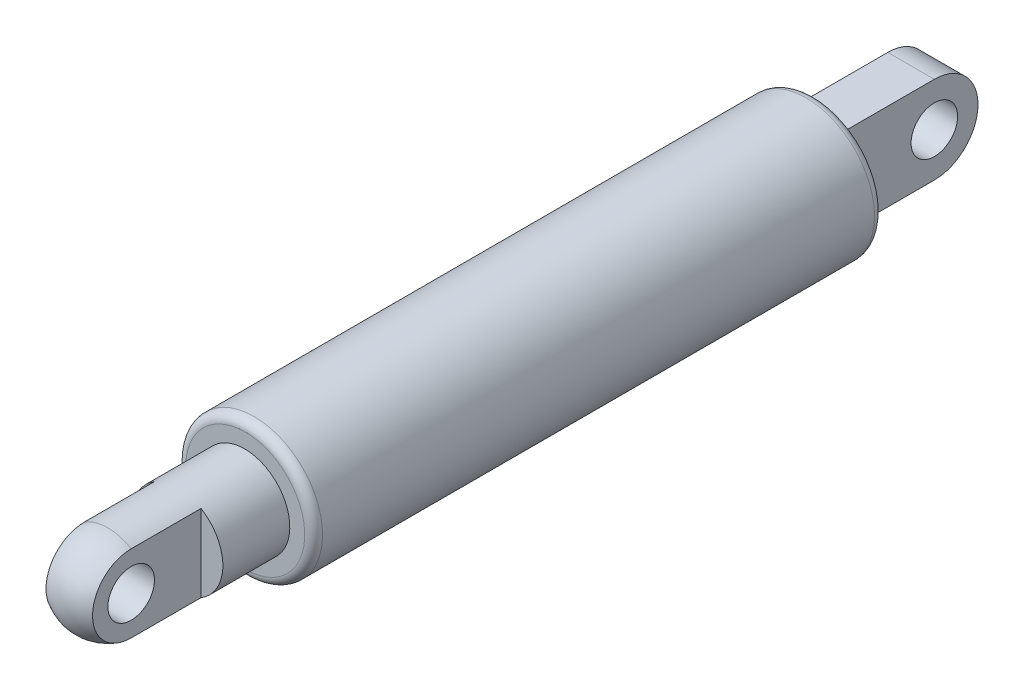
ISO-10303-21;
HEADER;
FILE_DESCRIPTION(('STEP AP214'),'2;1');
FILE_NAME('part.step','',(''),(''),'','','');
FILE_SCHEMA(('AUTOMOTIVE_DESIGN { 1 0 10303 214 1 1 1 1 }'));
ENDSEC;
DATA;
#1=APPLICATION_CONTEXT('core data for automotive mechanical design processes');
#2=APPLICATION_PROTOCOL_DEFINITION('international standard','automotive_design',2000,#1);
#3=PRODUCT_CONTEXT('',#1,'mechanical');
#4=PRODUCT('Part','Part','',(#3));
#5=PRODUCT_RELATED_PRODUCT_CATEGORY('part','',(#4));
#6=PRODUCT_DEFINITION_FORMATION('','',#4);
#7=PRODUCT_DEFINITION_CONTEXT('part definition',#1,'design');
#8=PRODUCT_DEFINITION('design','',#6,#7);
#9=PRODUCT_DEFINITION_SHAPE('','',#8);
#10=(LENGTH_UNIT() NAMED_UNIT(*) SI_UNIT(.MILLI.,.METRE.));
#11=(NAMED_UNIT(*) PLANE_ANGLE_UNIT() SI_UNIT($,.RADIAN.));
#12=(NAMED_UNIT(*) SI_UNIT($,.STERADIAN.) SOLID_ANGLE_UNIT());
#13=UNCERTAINTY_MEASURE_WITH_UNIT(LENGTH_MEASURE(1.E-05),#10,'distance_accuracy_value','');
#14=(GEOMETRIC_REPRESENTATION_CONTEXT(3) GLOBAL_UNCERTAINTY_ASSIGNED_CONTEXT((#13)) GLOBAL_UNIT_ASSIGNED_CONTEXT((#10,
#11,#12)) REPRESENTATION_CONTEXT('',''));
#15=CARTESIAN_POINT('',(0.,0.,0.));
#16=DIRECTION('',(0.,0.,1.));
#17=DIRECTION('',(1.,0.,0.));
#18=AXIS2_PLACEMENT_3D('',#15,#16,#17);
#19=CARTESIAN_POINT('',(0.,0.,28.956));
#20=DIRECTION('',(0.,0.,-1.));
#21=DIRECTION('',(0.,1.,0.));
#22=AXIS2_PLACEMENT_3D('',#19,#20,#21);
#23=CYLINDRICAL_SURFACE('',#22,3.937);
#24=CARTESIAN_POINT('',(0.,0.,25.019));
#25=DIRECTION('',(0.,0.,-1.));
#26=DIRECTION('',(0.,1.,0.));
#27=AXIS2_PLACEMENT_3D('',#24,#25,#26);
#28=CIRCLE('',#27,3.937);
#29=CARTESIAN_POINT('',(-2.032,3.37208318402734,25.019));
#30=VERTEX_POINT('',#29);
#31=CARTESIAN_POINT('',(2.032,3.37208318402734,25.019));
#32=VERTEX_POINT('',#31);
#33=EDGE_CURVE('E68',#30,#32,#28,.T.);
#34=ORIENTED_EDGE('',*,*,#33,.T.);
#35=DIRECTION('',(0.,0.,-1.));
#36=VECTOR('',#35,1.);
#37=CARTESIAN_POINT('',(2.032,3.37208318402734,28.956));
#38=LINE('',#37,#36);
#39=CARTESIAN_POINT('',(2.032,3.37208318402735,18.923));
#40=VERTEX_POINT('',#39);
#41=EDGE_CURVE('E98',#32,#40,#38,.T.);
#42=ORIENTED_EDGE('',*,*,#41,.T.);
#43=CARTESIAN_POINT('',(0.,0.,18.923));
#44=DIRECTION('',(0.,0.,1.));
#45=DIRECTION('',(1.,0.,0.));
#46=AXIS2_PLACEMENT_3D('',#43,#44,#45);
#47=CIRCLE('',#46,3.937);
#48=CARTESIAN_POINT('',(2.032,-3.37208318402734,18.923));
#49=VERTEX_POINT('',#48);
#50=EDGE_CURVE('E50',#40,#49,#47,.F.);
#51=ORIENTED_EDGE('',*,*,#50,.T.);
#52=DIRECTION('',(0.,0.,-1.));
#53=VECTOR('',#52,1.);
#54=CARTESIAN_POINT('',(2.032,-3.37208318402734,28.956));
#55=LINE('',#54,#53);
#56=CARTESIAN_POINT('',(2.032,-3.37208318402734,25.019));
#57=VERTEX_POINT('',#56);
#58=EDGE_CURVE('E89',#49,#57,#55,.F.);
#59=ORIENTED_EDGE('',*,*,#58,.T.);
#60=CARTESIAN_POINT('',(-2.032,-3.37208318402734,25.019));
#61=VERTEX_POINT('',#60);
#62=EDGE_CURVE('E61',#57,#61,#28,.T.);
#63=ORIENTED_EDGE('',*,*,#62,.T.);
#64=DIRECTION('',(0.,0.,-1.));
#65=VECTOR('',#64,1.);
#66=CARTESIAN_POINT('',(-2.032,-3.37208318402735,28.956));
#67=LINE('',#66,#65);
#68=CARTESIAN_POINT('',(-2.032,-3.37208318402734,18.923));
#69=VERTEX_POINT('',#68);
#70=EDGE_CURVE('E123',#61,#69,#67,.T.);
#71=ORIENTED_EDGE('',*,*,#70,.T.);
#72=CARTESIAN_POINT('',(-2.032,3.37208318402735,18.923));
#73=VERTEX_POINT('',#72);
#74=EDGE_CURVE('E13',#69,#73,#47,.F.);
#75=ORIENTED_EDGE('',*,*,#74,.T.);
#76=DIRECTION('',(0.,0.,-1.));
#77=VECTOR('',#76,1.);
#78=CARTESIAN_POINT('',(-2.032,3.37208318402735,28.956));
#79=LINE('',#78,#77);
#80=EDGE_CURVE('E126',#73,#30,#79,.F.);
#81=ORIENTED_EDGE('',*,*,#80,.T.);
#82=EDGE_LOOP('',(#34,#42,#51,#59,#63,#71,#75,#81));
#83=FACE_BOUND('',#82,.T.);
#84=CARTESIAN_POINT('',(0.,0.,13.081));
#85=DIRECTION('',(0.,0.,-1.));
#86=DIRECTION('',(0.,1.,0.));
#87=AXIS2_PLACEMENT_3D('',#84,#85,#86);
#88=CIRCLE('',#87,3.937);
#89=CARTESIAN_POINT('',(0.,3.937,13.081));
#90=VERTEX_POINT('',#89);
#91=EDGE_CURVE('E113',#90,#90,#88,.T.);
#92=ORIENTED_EDGE('',*,*,#91,.F.);
#93=EDGE_LOOP('',(#92));
#94=FACE_BOUND('',#93,.T.);
#95=ADVANCED_FACE('F46',(#83,#94),#23,.T.);
#96=CARTESIAN_POINT('',(0.,0.,25.019));
#97=DIRECTION('',(0.,0.,-1.));
#98=DIRECTION('',(0.,1.,0.));
#99=AXIS2_PLACEMENT_3D('',#96,#97,#98);
#100=SPHERICAL_SURFACE('',#99,3.937);
#101=ORIENTED_EDGE('',*,*,#33,.F.);
#102=CARTESIAN_POINT('',(-2.032,0.,25.019));
#103=DIRECTION('',(-1.,0.,0.));
#104=DIRECTION('',(0.,0.,1.));
#105=AXIS2_PLACEMENT_3D('',#102,#103,#104);
#106=CIRCLE('',#105,3.37208318402734);
#107=EDGE_CURVE('E119',#30,#61,#106,.F.);
#108=ORIENTED_EDGE('',*,*,#107,.T.);
#109=ORIENTED_EDGE('',*,*,#62,.F.);
#110=CARTESIAN_POINT('',(2.032,0.,25.019));
#111=DIRECTION('',(1.,0.,0.));
#112=DIRECTION('',(0.,1.,0.));
#113=AXIS2_PLACEMENT_3D('',#110,#111,#112);
#114=CIRCLE('',#113,3.37208318402734);
#115=EDGE_CURVE('E95',#57,#32,#114,.F.);
#116=ORIENTED_EDGE('',*,*,#115,.T.);
#117=EDGE_LOOP('',(#101,#108,#109,#116));
#118=FACE_BOUND('',#117,.T.);
#119=ADVANCED_FACE('F136',(#118),#100,.T.);
#120=CARTESIAN_POINT('',(0.,2.032,-19.2278));
#121=DIRECTION('',(0.,0.,-1.));
#122=DIRECTION('',(-1.,0.,0.));
#123=AXIS2_PLACEMENT_3D('',#120,#121,#122);
#124=PLANE('',#123);
#125=CARTESIAN_POINT('',(0.,0.,-19.2278));
#126=DIRECTION('',(0.,0.,-1.));
#127=DIRECTION('',(-1.,0.,0.));
#128=AXIS2_PLACEMENT_3D('',#125,#126,#127);
#129=CIRCLE('',#128,2.032);
#130=CARTESIAN_POINT('',(-2.032,0.,-19.2278));
#131=VERTEX_POINT('',#130);
#132=EDGE_CURVE('E106',#131,#131,#129,.T.);
#133=ORIENTED_EDGE('',*,*,#132,.T.);
#134=EDGE_LOOP('',(#133));
#135=FACE_BOUND('',#134,.T.);
#136=ADVANCED_FACE('F48',(#135),#124,.T.);
#137=CARTESIAN_POINT('',(0.,0.,13.081));
#138=DIRECTION('',(0.,0.,-1.));
#139=DIRECTION('',(-1.,0.,0.));
#140=AXIS2_PLACEMENT_3D('',#137,#138,#139);
#141=CYLINDRICAL_SURFACE('',#140,2.032);
#142=CARTESIAN_POINT('',(0.,0.,13.081));
#143=DIRECTION('',(0.,0.,-1.));
#144=DIRECTION('',(0.,1.,0.));
#145=AXIS2_PLACEMENT_3D('',#142,#143,#144);
#146=CIRCLE('',#145,2.032);
#147=CARTESIAN_POINT('',(0.,2.032,13.081));
#148=VERTEX_POINT('',#147);
#149=EDGE_CURVE('E108',#148,#148,#146,.F.);
#150=ORIENTED_EDGE('',*,*,#149,.F.);
#151=EDGE_LOOP('',(#150));
#152=FACE_BOUND('',#151,.T.);
#153=ORIENTED_EDGE('',*,*,#132,.F.);
#154=EDGE_LOOP('',(#153));
#155=FACE_BOUND('',#154,.T.);
#156=ADVANCED_FACE('F145',(#152,#155),#141,.T.);
#157=CARTESIAN_POINT('',(0.,0.,13.081));
#158=DIRECTION('',(0.,0.,-1.));
#159=DIRECTION('',(0.,1.,0.));
#160=AXIS2_PLACEMENT_3D('',#157,#158,#159);
#161=PLANE('',#160);
#162=ORIENTED_EDGE('',*,*,#149,.T.);
#163=EDGE_LOOP('',(#162));
#164=FACE_BOUND('',#163,.T.);
#165=ORIENTED_EDGE('',*,*,#91,.T.);
#166=EDGE_LOOP('',(#165));
#167=FACE_BOUND('',#166,.T.);
#168=ADVANCED_FACE('F134',(#164,#167),#161,.T.);
#169=CARTESIAN_POINT('',(2.032,3.937,18.923));
#170=DIRECTION('',(1.,0.,0.));
#171=DIRECTION('',(0.,1.,0.));
#172=AXIS2_PLACEMENT_3D('',#169,#170,#171);
#173=PLANE('',#172);
#174=DIRECTION('',(0.,1.,0.));
#175=VECTOR('',#174,1.);
#176=CARTESIAN_POINT('',(2.032,3.937,18.923));
#177=LINE('',#176,#175);
#178=EDGE_CURVE('E93',#49,#40,#177,.T.);
#179=ORIENTED_EDGE('',*,*,#178,.T.);
#180=ORIENTED_EDGE('',*,*,#41,.F.);
#181=ORIENTED_EDGE('',*,*,#115,.F.);
#182=ORIENTED_EDGE('',*,*,#58,.F.);
#183=EDGE_LOOP('',(#179,#180,#181,#182));
#184=FACE_BOUND('',#183,.T.);
#185=CARTESIAN_POINT('',(2.032,0.,25.019));
#186=DIRECTION('',(1.,0.,0.));
#187=DIRECTION('',(0.,1.,0.));
#188=AXIS2_PLACEMENT_3D('',#185,#186,#187);
#189=CIRCLE('',#188,2.03200000000001);
#190=CARTESIAN_POINT('',(2.032,0.,22.987));
#191=VERTEX_POINT('',#190);
#192=EDGE_CURVE('E102',#191,#191,#189,.F.);
#193=ORIENTED_EDGE('',*,*,#192,.T.);
#194=EDGE_LOOP('',(#193));
#195=FACE_BOUND('',#194,.T.);
#196=ADVANCED_FACE('F91',(#184,#195),#173,.T.);
#197=CARTESIAN_POINT('',(0.,0.,18.923));
#198=DIRECTION('',(0.,0.,1.));
#199=DIRECTION('',(1.,0.,0.));
#200=AXIS2_PLACEMENT_3D('',#197,#198,#199);
#201=PLANE('',#200);
#202=ORIENTED_EDGE('',*,*,#178,.F.);
#203=ORIENTED_EDGE('',*,*,#50,.F.);
#204=EDGE_LOOP('',(#202,#203));
#205=FACE_BOUND('',#204,.T.);
#206=ADVANCED_FACE('F101',(#205),#201,.T.);
#207=DIRECTION('',(0.,-1.,0.));
#208=VECTOR('',#207,1.);
#209=CARTESIAN_POINT('',(-2.032,3.937,18.923));
#210=LINE('',#209,#208);
#211=EDGE_CURVE('E103',#73,#69,#210,.T.);
#212=ORIENTED_EDGE('',*,*,#211,.F.);
#213=ORIENTED_EDGE('',*,*,#74,.F.);
#214=EDGE_LOOP('',(#212,#213));
#215=FACE_BOUND('',#214,.T.);
#216=ADVANCED_FACE('F192',(#215),#201,.T.);
#217=CARTESIAN_POINT('',(-2.032,3.937,18.923));
#218=DIRECTION('',(-1.,0.,0.));
#219=DIRECTION('',(0.,0.,1.));
#220=AXIS2_PLACEMENT_3D('',#217,#218,#219);
#221=PLANE('',#220);
#222=ORIENTED_EDGE('',*,*,#211,.T.);
#223=ORIENTED_EDGE('',*,*,#70,.F.);
#224=ORIENTED_EDGE('',*,*,#107,.F.);
#225=ORIENTED_EDGE('',*,*,#80,.F.);
#226=EDGE_LOOP('',(#222,#223,#224,#225));
#227=FACE_BOUND('',#226,.T.);
#228=CARTESIAN_POINT('',(-2.032,0.,25.019));
#229=DIRECTION('',(-1.,0.,0.));
#230=DIRECTION('',(0.,0.,1.));
#231=AXIS2_PLACEMENT_3D('',#228,#229,#230);
#232=CIRCLE('',#231,2.03200000000001);
#233=CARTESIAN_POINT('',(-2.032,0.,22.987));
#234=VERTEX_POINT('',#233);
#235=EDGE_CURVE('E97',#234,#234,#232,.F.);
#236=ORIENTED_EDGE('',*,*,#235,.T.);
#237=EDGE_LOOP('',(#236));
#238=FACE_BOUND('',#237,.T.);
#239=ADVANCED_FACE('F200',(#227,#238),#221,.T.);
#240=CARTESIAN_POINT('',(-5.969,0.,25.019));
#241=DIRECTION('',(1.,0.,0.));
#242=DIRECTION('',(0.,0.,-1.));
#243=AXIS2_PLACEMENT_3D('',#240,#241,#242);
#244=CYLINDRICAL_SURFACE('',#243,2.03200000000001);
#245=CARTESIAN_POINT('',(2.032,0.,22.987));
#246=CARTESIAN_POINT('',(1.98966666666666,0.,22.987));
#247=CARTESIAN_POINT('',(1.94733333333333,0.,22.987));
#248=CARTESIAN_POINT('',(1.86266666666666,0.,22.987));
#249=CARTESIAN_POINT('',(1.82033333333333,0.,22.987));
#250=CARTESIAN_POINT('',(1.73566666666667,0.,22.987));
#251=CARTESIAN_POINT('',(1.69333333333333,0.,22.987));
#252=CARTESIAN_POINT('',(1.60866666666667,0.,22.987));
#253=CARTESIAN_POINT('',(1.56633333333333,0.,22.987));
#254=CARTESIAN_POINT('',(1.48166666666666,0.,22.987));
#255=CARTESIAN_POINT('',(1.43933333333333,0.,22.987));
#256=CARTESIAN_POINT('',(1.35466666666666,0.,22.987));
#257=CARTESIAN_POINT('',(1.31233333333333,0.,22.987));
#258=CARTESIAN_POINT('',(1.22766666666667,0.,22.987));
#259=CARTESIAN_POINT('',(1.18533333333333,0.,22.987));
#260=CARTESIAN_POINT('',(1.10066666666667,0.,22.987));
#261=CARTESIAN_POINT('',(1.05833333333333,0.,22.987));
#262=CARTESIAN_POINT('',(0.973666666666665,0.,22.987));
#263=CARTESIAN_POINT('',(0.931333333333332,0.,22.987));
#264=CARTESIAN_POINT('',(0.846666666666665,0.,22.987));
#265=CARTESIAN_POINT('',(0.804333333333332,0.,22.987));
#266=CARTESIAN_POINT('',(0.719666666666666,0.,22.987));
#267=CARTESIAN_POINT('',(0.677333333333332,0.,22.987));
#268=CARTESIAN_POINT('',(0.592666666666666,0.,22.987));
#269=CARTESIAN_POINT('',(0.550333333333332,0.,22.987));
#270=CARTESIAN_POINT('',(0.465666666666665,0.,22.987));
#271=CARTESIAN_POINT('',(0.423333333333332,0.,22.987));
#272=CARTESIAN_POINT('',(0.338666666666665,0.,22.987));
#273=CARTESIAN_POINT('',(0.296333333333332,0.,22.987));
#274=CARTESIAN_POINT('',(0.211666666666666,0.,22.987));
#275=CARTESIAN_POINT('',(0.169333333333333,0.,22.987));
#276=CARTESIAN_POINT('',(0.0846666666666661,0.,22.987));
#277=CARTESIAN_POINT('',(0.0423333333333326,0.,22.987));
#278=CARTESIAN_POINT('',(-0.0423333333333343,0.,22.987));
#279=CARTESIAN_POINT('',(-0.0846666666666678,0.,22.987));
#280=CARTESIAN_POINT('',(-0.169333333333334,0.,22.987));
#281=CARTESIAN_POINT('',(-0.211666666666668,0.,22.987));
#282=CARTESIAN_POINT('',(-0.296333333333334,0.,22.987));
#283=CARTESIAN_POINT('',(-0.338666666666667,0.,22.987));
#284=CARTESIAN_POINT('',(-0.423333333333334,0.,22.987));
#285=CARTESIAN_POINT('',(-0.465666666666667,0.,22.987));
#286=CARTESIAN_POINT('',(-0.550333333333334,0.,22.987));
#287=CARTESIAN_POINT('',(-0.592666666666668,0.,22.987));
#288=CARTESIAN_POINT('',(-0.677333333333334,0.,22.987));
#289=CARTESIAN_POINT('',(-0.719666666666667,0.,22.987));
#290=CARTESIAN_POINT('',(-0.804333333333334,0.,22.987));
#291=CARTESIAN_POINT('',(-0.846666666666667,0.,22.987));
#292=CARTESIAN_POINT('',(-0.931333333333333,0.,22.987));
#293=CARTESIAN_POINT('',(-0.973666666666667,0.,22.987));
#294=CARTESIAN_POINT('',(-1.05833333333333,0.,22.987));
#295=CARTESIAN_POINT('',(-1.10066666666667,0.,22.987));
#296=CARTESIAN_POINT('',(-1.18533333333333,0.,22.987));
#297=CARTESIAN_POINT('',(-1.22766666666667,0.,22.987));
#298=CARTESIAN_POINT('',(-1.31233333333333,0.,22.987));
#299=CARTESIAN_POINT('',(-1.35466666666667,0.,22.987));
#300=CARTESIAN_POINT('',(-1.43933333333333,0.,22.987));
#301=CARTESIAN_POINT('',(-1.48166666666667,0.,22.987));
#302=CARTESIAN_POINT('',(-1.56633333333333,0.,22.987));
#303=CARTESIAN_POINT('',(-1.60866666666667,0.,22.987));
#304=CARTESIAN_POINT('',(-1.69333333333333,0.,22.987));
#305=CARTESIAN_POINT('',(-1.73566666666667,0.,22.987));
#306=CARTESIAN_POINT('',(-1.82033333333333,0.,22.987));
#307=CARTESIAN_POINT('',(-1.86266666666667,0.,22.987));
#308=CARTESIAN_POINT('',(-1.94733333333333,0.,22.987));
#309=CARTESIAN_POINT('',(-1.98966666666667,0.,22.987));
#310=CARTESIAN_POINT('',(-2.032,0.,22.987));
#311=B_SPLINE_CURVE_WITH_KNOTS('',3,(#245,#246,#247,#248,#249,#250,#251,#252,#253,#254,#255,
#256,#257,#258,#259,#260,#261,#262,#263,#264,#265,#266,#267,#268,#269,#270,#271,#272,#273,#274,
#275,#276,#277,#278,#279,#280,#281,#282,#283,#284,#285,#286,#287,#288,#289,#290,#291,#292,#293,
#294,#295,#296,#297,#298,#299,#300,#301,#302,#303,#304,#305,#306,#307,#308,#309,#310),
.UNSPECIFIED.,.F.,.F.,(4,2,2,2,2,2,2,2,2,2,2,2,2,2,2,2,2,2,2,2,2,2,2,2,2,2,2,2,2,2,2,2,4),(0.,
0.127,0.254,0.380999999999999,0.508,0.635,0.762,0.888999999999999,1.016,1.143,1.27,1.397,1.524,
1.651,1.778,1.905,2.032,2.159,2.286,2.413,2.54,2.667,2.794,2.921,3.048,3.175,3.302,3.429,3.556,
3.683,3.81,3.937,4.064),.UNSPECIFIED.);
#312=EDGE_CURVE('BSEAM208',#191,#234,#311,.T.);
#313=ORIENTED_EDGE('',*,*,#192,.F.);
#314=ORIENTED_EDGE('',*,*,#235,.F.);
#315=ORIENTED_EDGE('',*,*,#312,.T.);
#316=ORIENTED_EDGE('',*,*,#312,.F.);
#317=EDGE_LOOP('',(#313,#315,#314,#316));
#318=FACE_BOUND('',#317,.T.);
#319=ADVANCED_FACE('F208',(#318),#244,.F.);
#320=CLOSED_SHELL('',(#95,#119,#136,#156,#168,#196,#206,#216,#239,#319));
#321=MANIFOLD_SOLID_BREP('B2',#320);
#322=CARTESIAN_POINT('',(0.,0.,-36.703));
#323=DIRECTION('',(0.,0.,1.));
#324=DIRECTION('',(1.,0.,0.));
#325=AXIS2_PLACEMENT_3D('',#322,#323,#324);
#326=PLANE('',#325);
#327=CARTESIAN_POINT('',(0.,0.,-36.703));
#328=DIRECTION('',(0.,0.,1.));
#329=DIRECTION('',(1.,0.,0.));
#330=AXIS2_PLACEMENT_3D('',#327,#328,#329);
#331=CIRCLE('',#330,5.19176);
#332=CARTESIAN_POINT('',(5.19176,0.,-36.703));
#333=VERTEX_POINT('',#332);
#334=EDGE_CURVE('E241',#333,#333,#331,.F.);
#335=ORIENTED_EDGE('',*,*,#334,.T.);
#336=EDGE_LOOP('',(#335));
#337=FACE_BOUND('',#336,.T.);
#338=DIRECTION('',(-1.,0.,0.));
#339=VECTOR('',#338,1.);
#340=CARTESIAN_POINT('',(2.032,-3.81,-36.703));
#341=LINE('',#340,#339);
#342=CARTESIAN_POINT('',(2.032,-3.81,-36.703));
#343=VERTEX_POINT('',#342);
#344=CARTESIAN_POINT('',(-2.032,-3.81,-36.703));
#345=VERTEX_POINT('',#344);
#346=EDGE_CURVE('E248',#343,#345,#341,.T.);
#347=ORIENTED_EDGE('',*,*,#346,.F.);
#348=DIRECTION('',(0.,-1.,0.));
#349=VECTOR('',#348,1.);
#350=CARTESIAN_POINT('',(2.032,-3.81,-36.703));
#351=LINE('',#350,#349);
#352=CARTESIAN_POINT('',(2.032,3.81,-36.703));
#353=VERTEX_POINT('',#352);
#354=EDGE_CURVE('E280',#353,#343,#351,.T.);
#355=ORIENTED_EDGE('',*,*,#354,.F.);
#356=DIRECTION('',(-1.,0.,0.));
#357=VECTOR('',#356,1.);
#358=CARTESIAN_POINT('',(2.032,3.81,-36.703));
#359=LINE('',#358,#357);
#360=CARTESIAN_POINT('',(-2.032,3.81,-36.703));
#361=VERTEX_POINT('',#360);
#362=EDGE_CURVE('E296',#353,#361,#359,.T.);
#363=ORIENTED_EDGE('',*,*,#362,.T.);
#364=DIRECTION('',(0.,-1.,0.));
#365=VECTOR('',#364,1.);
#366=CARTESIAN_POINT('',(-2.032,-3.81,-36.703));
#367=LINE('',#366,#365);
#368=EDGE_CURVE('E253',#361,#345,#367,.T.);
#369=ORIENTED_EDGE('',*,*,#368,.T.);
#370=EDGE_LOOP('',(#347,#355,#363,#369));
#371=FACE_BOUND('',#370,.T.);
#372=ADVANCED_FACE('F233',(#337,#371),#326,.F.);
#373=CARTESIAN_POINT('',(0.,0.,45.085));
#374=DIRECTION('',(0.,0.,1.));
#375=DIRECTION('',(1.,0.,0.));
#376=AXIS2_PLACEMENT_3D('',#373,#374,#375);
#377=CYLINDRICAL_SURFACE('',#376,5.969);
#378=CARTESIAN_POINT('',(0.,0.,-35.92576));
#379=DIRECTION('',(0.,0.,1.));
#380=DIRECTION('',(1.,0.,0.));
#381=AXIS2_PLACEMENT_3D('',#378,#379,#380);
#382=CIRCLE('',#381,5.969);
#383=CARTESIAN_POINT('',(5.969,0.,-35.92576));
#384=VERTEX_POINT('',#383);
#385=EDGE_CURVE('E320',#384,#384,#382,.T.);
#386=ORIENTED_EDGE('',*,*,#385,.T.);
#387=EDGE_LOOP('',(#386));
#388=FACE_BOUND('',#387,.T.);
#389=CARTESIAN_POINT('',(0.,0.,12.25296));
#390=DIRECTION('',(0.,0.,-1.));
#391=DIRECTION('',(-1.,0.,0.));
#392=AXIS2_PLACEMENT_3D('',#389,#390,#391);
#393=CIRCLE('',#392,5.969);
#394=CARTESIAN_POINT('',(-5.969,0.,12.25296));
#395=VERTEX_POINT('',#394);
#396=EDGE_CURVE('E317',#395,#395,#393,.T.);
#397=ORIENTED_EDGE('',*,*,#396,.T.);
#398=EDGE_LOOP('',(#397));
#399=FACE_BOUND('',#398,.T.);
#400=ADVANCED_FACE('F332',(#388,#399),#377,.T.);
#401=CARTESIAN_POINT('',(0.,2.0828,13.0302));
#402=DIRECTION('',(0.,0.,-1.));
#403=DIRECTION('',(-1.,0.,0.));
#404=AXIS2_PLACEMENT_3D('',#401,#402,#403);
#405=PLANE('',#404);
#406=CARTESIAN_POINT('',(0.,0.,13.0302));
#407=DIRECTION('',(0.,0.,-1.));
#408=DIRECTION('',(-1.,0.,0.));
#409=AXIS2_PLACEMENT_3D('',#406,#407,#408);
#410=CIRCLE('',#409,5.19176);
#411=CARTESIAN_POINT('',(-5.19176,0.,13.0302));
#412=VERTEX_POINT('',#411);
#413=EDGE_CURVE('E44',#412,#412,#410,.F.);
#414=ORIENTED_EDGE('',*,*,#413,.T.);
#415=EDGE_LOOP('',(#414));
#416=FACE_BOUND('',#415,.T.);
#417=CARTESIAN_POINT('',(0.,0.,13.0302));
#418=DIRECTION('',(0.,0.,1.));
#419=DIRECTION('',(1.,0.,0.));
#420=AXIS2_PLACEMENT_3D('',#417,#418,#419);
#421=CIRCLE('',#420,2.0828);
#422=CARTESIAN_POINT('',(2.0828,0.,13.0302));
#423=VERTEX_POINT('',#422);
#424=EDGE_CURVE('E314',#423,#423,#421,.T.);
#425=ORIENTED_EDGE('',*,*,#424,.F.);
#426=EDGE_LOOP('',(#425));
#427=FACE_BOUND('',#426,.T.);
#428=ADVANCED_FACE('F335',(#416,#427),#405,.F.);
#429=CARTESIAN_POINT('',(0.,0.,45.085));
#430=DIRECTION('',(0.,0.,1.));
#431=DIRECTION('',(1.,0.,0.));
#432=AXIS2_PLACEMENT_3D('',#429,#430,#431);
#433=CYLINDRICAL_SURFACE('',#432,2.0828);
#434=CARTESIAN_POINT('',(0.,0.,-19.2786));
#435=DIRECTION('',(0.,0.,1.));
#436=DIRECTION('',(1.,0.,0.));
#437=AXIS2_PLACEMENT_3D('',#434,#435,#436);
#438=CIRCLE('',#437,2.0828);
#439=CARTESIAN_POINT('',(2.0828,0.,-19.2786));
#440=VERTEX_POINT('',#439);
#441=EDGE_CURVE('E311',#440,#440,#438,.T.);
#442=ORIENTED_EDGE('',*,*,#441,.F.);
#443=EDGE_LOOP('',(#442));
#444=FACE_BOUND('',#443,.T.);
#445=ORIENTED_EDGE('',*,*,#424,.T.);
#446=EDGE_LOOP('',(#445));
#447=FACE_BOUND('',#446,.T.);
#448=ADVANCED_FACE('F345',(#444,#447),#433,.F.);
#449=CARTESIAN_POINT('',(0.,2.0828,-19.2786));
#450=DIRECTION('',(0.,0.,-1.));
#451=DIRECTION('',(-1.,0.,0.));
#452=AXIS2_PLACEMENT_3D('',#449,#450,#451);
#453=PLANE('',#452);
#454=ORIENTED_EDGE('',*,*,#441,.T.);
#455=EDGE_LOOP('',(#454));
#456=FACE_BOUND('',#455,.T.);
#457=ADVANCED_FACE('F329',(#456),#453,.F.);
#458=CARTESIAN_POINT('',(0.,0.,-35.92576));
#459=DIRECTION('',(0.,0.,1.));
#460=DIRECTION('',(1.,0.,0.));
#461=AXIS2_PLACEMENT_3D('',#458,#459,#460);
#462=TOROIDAL_SURFACE('',#461,5.19176,0.77724);
#463=ORIENTED_EDGE('',*,*,#334,.F.);
#464=EDGE_LOOP('',(#463));
#465=FACE_BOUND('',#464,.T.);
#466=ORIENTED_EDGE('',*,*,#385,.F.);
#467=EDGE_LOOP('',(#466));
#468=FACE_BOUND('',#467,.T.);
#469=ADVANCED_FACE('F326',(#465,#468),#462,.T.);
#470=CARTESIAN_POINT('',(0.,0.,12.25296));
#471=DIRECTION('',(0.,0.,-1.));
#472=DIRECTION('',(-1.,0.,0.));
#473=AXIS2_PLACEMENT_3D('',#470,#471,#472);
#474=TOROIDAL_SURFACE('',#473,5.19176,0.77724);
#475=ORIENTED_EDGE('',*,*,#396,.F.);
#476=EDGE_LOOP('',(#475));
#477=FACE_BOUND('',#476,.T.);
#478=ORIENTED_EDGE('',*,*,#413,.F.);
#479=EDGE_LOOP('',(#478));
#480=FACE_BOUND('',#479,.T.);
#481=ADVANCED_FACE('F235',(#477,#480),#474,.T.);
#482=CARTESIAN_POINT('',(2.032,0.,-45.085));
#483=DIRECTION('',(-1.,0.,0.));
#484=DIRECTION('',(0.,0.,1.));
#485=AXIS2_PLACEMENT_3D('',#482,#483,#484);
#486=PLANE('',#485);
#487=ORIENTED_EDGE('',*,*,#354,.T.);
#488=DIRECTION('',(0.,0.,-1.));
#489=VECTOR('',#488,1.);
#490=CARTESIAN_POINT('',(2.032,-3.81,-36.703));
#491=LINE('',#490,#489);
#492=CARTESIAN_POINT('',(2.032,-3.81,-45.085));
#493=VERTEX_POINT('',#492);
#494=EDGE_CURVE('E272',#343,#493,#491,.T.);
#495=ORIENTED_EDGE('',*,*,#494,.T.);
#496=CARTESIAN_POINT('',(2.032,0.,-45.085));
#497=DIRECTION('',(1.,0.,0.));
#498=DIRECTION('',(0.,0.,1.));
#499=AXIS2_PLACEMENT_3D('',#496,#497,#498);
#500=CIRCLE('',#499,3.81);
#501=CARTESIAN_POINT('',(2.032,3.81,-45.085));
#502=VERTEX_POINT('',#501);
#503=EDGE_CURVE('E278',#493,#502,#500,.T.);
#504=ORIENTED_EDGE('',*,*,#503,.T.);
#505=DIRECTION('',(0.,0.,1.));
#506=VECTOR('',#505,1.);
#507=CARTESIAN_POINT('',(2.032,3.81,-36.703));
#508=LINE('',#507,#506);
#509=EDGE_CURVE('E294',#502,#353,#508,.T.);
#510=ORIENTED_EDGE('',*,*,#509,.T.);
#511=EDGE_LOOP('',(#487,#495,#504,#510));
#512=FACE_BOUND('',#511,.T.);
#513=CARTESIAN_POINT('',(2.032,0.,-45.085));
#514=DIRECTION('',(1.,0.,0.));
#515=DIRECTION('',(0.,0.,-1.));
#516=AXIS2_PLACEMENT_3D('',#513,#514,#515);
#517=CIRCLE('',#516,2.03199999999998);
#518=CARTESIAN_POINT('',(2.032,0.,-47.117));
#519=VERTEX_POINT('',#518);
#520=EDGE_CURVE('E301',#519,#519,#517,.T.);
#521=ORIENTED_EDGE('',*,*,#520,.F.);
#522=EDGE_LOOP('',(#521));
#523=FACE_BOUND('',#522,.T.);
#524=ADVANCED_FACE('F274',(#512,#523),#486,.F.);
#525=CARTESIAN_POINT('',(-2.032,0.,-45.085));
#526=DIRECTION('',(-1.,0.,0.));
#527=DIRECTION('',(0.,0.,1.));
#528=AXIS2_PLACEMENT_3D('',#525,#526,#527);
#529=PLANE('',#528);
#530=ORIENTED_EDGE('',*,*,#368,.F.);
#531=DIRECTION('',(0.,0.,1.));
#532=VECTOR('',#531,1.);
#533=CARTESIAN_POINT('',(-2.032,3.81,-36.703));
#534=LINE('',#533,#532);
#535=CARTESIAN_POINT('',(-2.032,3.81,-45.085));
#536=VERTEX_POINT('',#535);
#537=EDGE_CURVE('E305',#536,#361,#534,.T.);
#538=ORIENTED_EDGE('',*,*,#537,.F.);
#539=CARTESIAN_POINT('',(-2.032,0.,-45.085));
#540=DIRECTION('',(1.,0.,0.));
#541=DIRECTION('',(0.,0.,1.));
#542=AXIS2_PLACEMENT_3D('',#539,#540,#541);
#543=CIRCLE('',#542,3.81);
#544=CARTESIAN_POINT('',(-2.032,-3.81,-45.085));
#545=VERTEX_POINT('',#544);
#546=EDGE_CURVE('E303',#545,#536,#543,.T.);
#547=ORIENTED_EDGE('',*,*,#546,.F.);
#548=DIRECTION('',(0.,0.,-1.));
#549=VECTOR('',#548,1.);
#550=CARTESIAN_POINT('',(-2.032,-3.81,-36.703));
#551=LINE('',#550,#549);
#552=EDGE_CURVE('E286',#345,#545,#551,.T.);
#553=ORIENTED_EDGE('',*,*,#552,.F.);
#554=EDGE_LOOP('',(#530,#538,#547,#553));
#555=FACE_BOUND('',#554,.T.);
#556=CARTESIAN_POINT('',(-2.032,0.,-45.085));
#557=DIRECTION('',(1.,0.,0.));
#558=DIRECTION('',(0.,0.,-1.));
#559=AXIS2_PLACEMENT_3D('',#556,#557,#558);
#560=CIRCLE('',#559,2.03199999999998);
#561=CARTESIAN_POINT('',(-2.032,0.,-47.117));
#562=VERTEX_POINT('',#561);
#563=EDGE_CURVE('E450',#562,#562,#560,.T.);
#564=ORIENTED_EDGE('',*,*,#563,.T.);
#565=EDGE_LOOP('',(#564));
#566=FACE_BOUND('',#565,.T.);
#567=ADVANCED_FACE('F393',(#555,#566),#529,.T.);
#568=CARTESIAN_POINT('',(2.032,-3.81,-36.703));
#569=DIRECTION('',(0.,1.,0.));
#570=DIRECTION('',(0.,0.,1.));
#571=AXIS2_PLACEMENT_3D('',#568,#569,#570);
#572=PLANE('',#571);
#573=ORIENTED_EDGE('',*,*,#552,.T.);
#574=DIRECTION('',(-1.,0.,0.));
#575=VECTOR('',#574,1.);
#576=CARTESIAN_POINT('',(2.032,-3.81,-45.085));
#577=LINE('',#576,#575);
#578=EDGE_CURVE('E284',#493,#545,#577,.T.);
#579=ORIENTED_EDGE('',*,*,#578,.F.);
#580=ORIENTED_EDGE('',*,*,#494,.F.);
#581=ORIENTED_EDGE('',*,*,#346,.T.);
#582=EDGE_LOOP('',(#573,#579,#580,#581));
#583=FACE_BOUND('',#582,.T.);
#584=ADVANCED_FACE('F285',(#583),#572,.F.);
#585=CARTESIAN_POINT('',(2.032,0.,-45.085));
#586=DIRECTION('',(-1.,0.,0.));
#587=DIRECTION('',(0.,0.,1.));
#588=AXIS2_PLACEMENT_3D('',#585,#586,#587);
#589=CYLINDRICAL_SURFACE('',#588,3.81);
#590=ORIENTED_EDGE('',*,*,#546,.T.);
#591=DIRECTION('',(-1.,0.,0.));
#592=VECTOR('',#591,1.);
#593=CARTESIAN_POINT('',(2.032,3.81,-45.085));
#594=LINE('',#593,#592);
#595=EDGE_CURVE('E289',#502,#536,#594,.T.);
#596=ORIENTED_EDGE('',*,*,#595,.F.);
#597=ORIENTED_EDGE('',*,*,#503,.F.);
#598=ORIENTED_EDGE('',*,*,#578,.T.);
#599=EDGE_LOOP('',(#590,#596,#597,#598));
#600=FACE_BOUND('',#599,.T.);
#601=ADVANCED_FACE('F291',(#600),#589,.T.);
#602=CARTESIAN_POINT('',(2.032,3.81,-36.703));
#603=DIRECTION('',(0.,-1.,0.));
#604=DIRECTION('',(0.,0.,-1.));
#605=AXIS2_PLACEMENT_3D('',#602,#603,#604);
#606=PLANE('',#605);
#607=ORIENTED_EDGE('',*,*,#537,.T.);
#608=ORIENTED_EDGE('',*,*,#362,.F.);
#609=ORIENTED_EDGE('',*,*,#509,.F.);
#610=ORIENTED_EDGE('',*,*,#595,.T.);
#611=EDGE_LOOP('',(#607,#608,#609,#610));
#612=FACE_BOUND('',#611,.T.);
#613=ADVANCED_FACE('F413',(#612),#606,.F.);
#614=CARTESIAN_POINT('',(2.032,0.,-45.085));
#615=DIRECTION('',(-1.,0.,0.));
#616=DIRECTION('',(0.,0.,1.));
#617=AXIS2_PLACEMENT_3D('',#614,#615,#616);
#618=CYLINDRICAL_SURFACE('',#617,2.03199999999998);
#619=ORIENTED_EDGE('',*,*,#520,.T.);
#620=EDGE_LOOP('',(#619));
#621=FACE_BOUND('',#620,.T.);
#622=ORIENTED_EDGE('',*,*,#563,.F.);
#623=EDGE_LOOP('',(#622));
#624=FACE_BOUND('',#623,.T.);
#625=ADVANCED_FACE('F420',(#621,#624),#618,.F.);
#626=CLOSED_SHELL('',(#372,#400,#428,#448,#457,#469,#481,#524,#567,#584,#601,#613,#625));
#627=MANIFOLD_SOLID_BREP('B7',#626);
#628=ADVANCED_BREP_SHAPE_REPRESENTATION('',(#18,#321,#627),#14);
#629=SHAPE_DEFINITION_REPRESENTATION(#9,#628);
ENDSEC;
END-ISO-10303-21;
